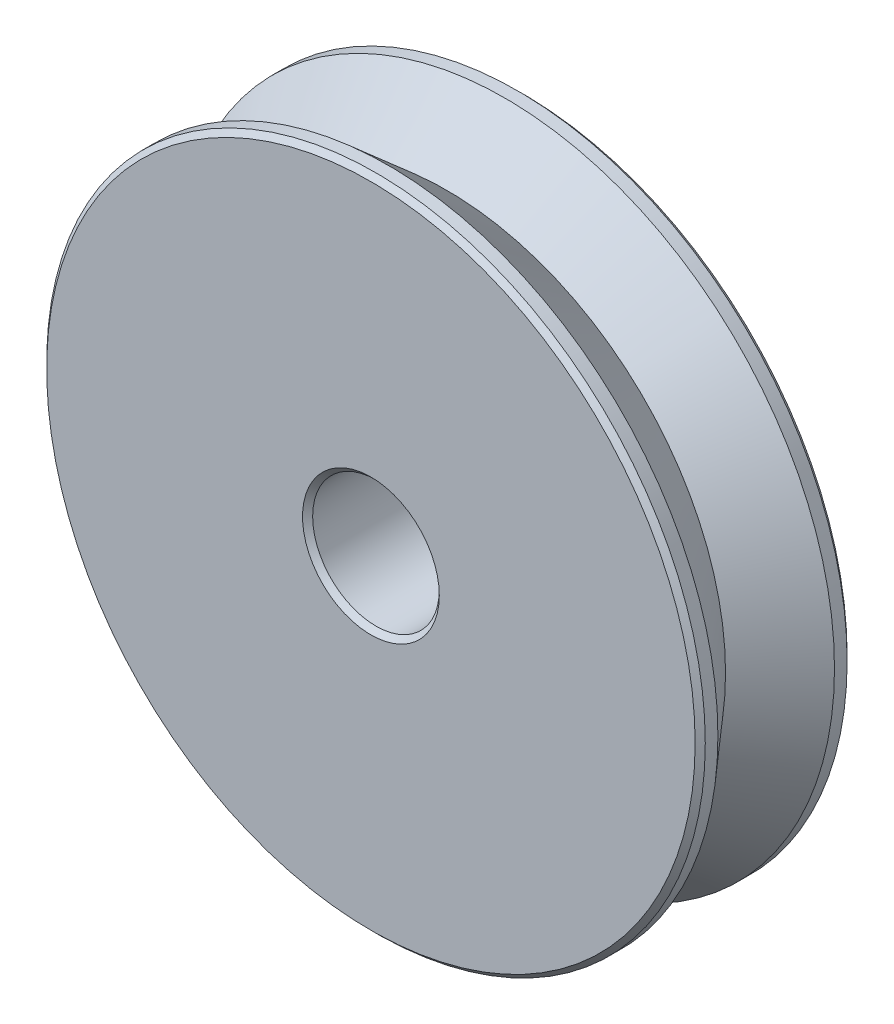
ISO-10303-21;
HEADER;
FILE_DESCRIPTION(('STEP AP214'),'2;1');
FILE_NAME('part.step','',(''),(''),'','','');
FILE_SCHEMA(('AUTOMOTIVE_DESIGN { 1 0 10303 214 1 1 1 1 }'));
ENDSEC;
DATA;
#1=APPLICATION_CONTEXT('core data for automotive mechanical design processes');
#2=APPLICATION_PROTOCOL_DEFINITION('international standard','automotive_design',2000,#1);
#3=PRODUCT_CONTEXT('',#1,'mechanical');
#4=PRODUCT('Part','Part','',(#3));
#5=PRODUCT_RELATED_PRODUCT_CATEGORY('part','',(#4));
#6=PRODUCT_DEFINITION_FORMATION('','',#4);
#7=PRODUCT_DEFINITION_CONTEXT('part definition',#1,'design');
#8=PRODUCT_DEFINITION('design','',#6,#7);
#9=PRODUCT_DEFINITION_SHAPE('','',#8);
#10=(LENGTH_UNIT() NAMED_UNIT(*) SI_UNIT(.MILLI.,.METRE.));
#11=(NAMED_UNIT(*) PLANE_ANGLE_UNIT() SI_UNIT($,.RADIAN.));
#12=(NAMED_UNIT(*) SI_UNIT($,.STERADIAN.) SOLID_ANGLE_UNIT());
#13=UNCERTAINTY_MEASURE_WITH_UNIT(LENGTH_MEASURE(1.E-05),#10,'distance_accuracy_value','');
#14=(GEOMETRIC_REPRESENTATION_CONTEXT(3) GLOBAL_UNCERTAINTY_ASSIGNED_CONTEXT((#13)) GLOBAL_UNIT_ASSIGNED_CONTEXT((#10,
#11,#12)) REPRESENTATION_CONTEXT('',''));
#15=CARTESIAN_POINT('',(0.,0.,0.));
#16=DIRECTION('',(0.,0.,1.));
#17=DIRECTION('',(1.,0.,0.));
#18=AXIS2_PLACEMENT_3D('',#15,#16,#17);
#19=CARTESIAN_POINT('',(0.,0.,3.));
#20=DIRECTION('',(0.,0.,-1.));
#21=DIRECTION('',(-1.,0.,0.));
#22=AXIS2_PLACEMENT_3D('',#19,#20,#21);
#23=CYLINDRICAL_SURFACE('',#22,13.);
#24=CARTESIAN_POINT('',(0.,0.,2.80000000000002));
#25=DIRECTION('',(0.,0.,1.));
#26=DIRECTION('',(1.,0.,0.));
#27=AXIS2_PLACEMENT_3D('',#24,#25,#26);
#28=CIRCLE('',#27,13.);
#29=CARTESIAN_POINT('',(13.,0.,2.80000000000002));
#30=VERTEX_POINT('',#29);
#31=EDGE_CURVE('E10',#30,#30,#28,.F.);
#32=ORIENTED_EDGE('',*,*,#31,.T.);
#33=EDGE_LOOP('',(#32));
#34=FACE_BOUND('',#33,.T.);
#35=CARTESIAN_POINT('',(0.,0.,2.30113545709572));
#36=DIRECTION('',(0.,0.,1.));
#37=DIRECTION('',(1.,0.,0.));
#38=AXIS2_PLACEMENT_3D('',#35,#36,#37);
#39=CIRCLE('',#38,13.);
#40=CARTESIAN_POINT('',(13.,0.,2.30113545709572));
#41=VERTEX_POINT('',#40);
#42=EDGE_CURVE('E74',#41,#41,#39,.T.);
#43=ORIENTED_EDGE('',*,*,#42,.T.);
#44=EDGE_LOOP('',(#43));
#45=FACE_BOUND('',#44,.T.);
#46=ADVANCED_FACE('F41',(#34,#45),#23,.T.);
#47=CARTESIAN_POINT('',(0.,0.,-2.8));
#48=DIRECTION('',(0.,0.,1.));
#49=DIRECTION('',(1.,0.,0.));
#50=AXIS2_PLACEMENT_3D('',#47,#48,#49);
#51=CIRCLE('',#50,13.);
#52=CARTESIAN_POINT('',(13.,0.,-2.8));
#53=VERTEX_POINT('',#52);
#54=EDGE_CURVE('E49',#53,#53,#51,.T.);
#55=ORIENTED_EDGE('',*,*,#54,.T.);
#56=EDGE_LOOP('',(#55));
#57=FACE_BOUND('',#56,.T.);
#58=CARTESIAN_POINT('',(0.,0.,-2.30113545709572));
#59=DIRECTION('',(0.,0.,1.));
#60=DIRECTION('',(1.,0.,0.));
#61=AXIS2_PLACEMENT_3D('',#58,#59,#60);
#62=CIRCLE('',#61,13.);
#63=CARTESIAN_POINT('',(13.,0.,-2.30113545709572));
#64=VERTEX_POINT('',#63);
#65=EDGE_CURVE('E77',#64,#64,#62,.T.);
#66=ORIENTED_EDGE('',*,*,#65,.F.);
#67=EDGE_LOOP('',(#66));
#68=FACE_BOUND('',#67,.T.);
#69=ADVANCED_FACE('F102',(#57,#68),#23,.T.);
#70=CARTESIAN_POINT('',(0.,0.,3.));
#71=DIRECTION('',(0.,0.,1.));
#72=DIRECTION('',(1.,0.,0.));
#73=AXIS2_PLACEMENT_3D('',#70,#71,#72);
#74=PLANE('',#73);
#75=CARTESIAN_POINT('',(0.,0.,3.));
#76=DIRECTION('',(0.,0.,1.));
#77=DIRECTION('',(1.,0.,0.));
#78=AXIS2_PLACEMENT_3D('',#75,#76,#77);
#79=CIRCLE('',#78,2.7);
#80=CARTESIAN_POINT('',(2.7,0.,3.));
#81=VERTEX_POINT('',#80);
#82=EDGE_CURVE('E53',#81,#81,#79,.F.);
#83=ORIENTED_EDGE('',*,*,#82,.T.);
#84=EDGE_LOOP('',(#83));
#85=FACE_BOUND('',#84,.T.);
#86=CARTESIAN_POINT('',(0.,0.,3.));
#87=DIRECTION('',(0.,0.,1.));
#88=DIRECTION('',(1.,0.,0.));
#89=AXIS2_PLACEMENT_3D('',#86,#87,#88);
#90=CIRCLE('',#89,12.8);
#91=CARTESIAN_POINT('',(12.8,0.,3.));
#92=VERTEX_POINT('',#91);
#93=EDGE_CURVE('E57',#92,#92,#90,.T.);
#94=ORIENTED_EDGE('',*,*,#93,.T.);
#95=EDGE_LOOP('',(#94));
#96=FACE_BOUND('',#95,.T.);
#97=ADVANCED_FACE('F107',(#85,#96),#74,.T.);
#98=CARTESIAN_POINT('',(0.,0.,-3.));
#99=DIRECTION('',(0.,0.,1.));
#100=DIRECTION('',(1.,0.,0.));
#101=AXIS2_PLACEMENT_3D('',#98,#99,#100);
#102=PLANE('',#101);
#103=CARTESIAN_POINT('',(0.,0.,-3.));
#104=DIRECTION('',(0.,0.,1.));
#105=DIRECTION('',(1.,0.,0.));
#106=AXIS2_PLACEMENT_3D('',#103,#104,#105);
#107=CIRCLE('',#106,2.7);
#108=CARTESIAN_POINT('',(-2.70000000000001,0.,-3.));
#109=VERTEX_POINT('',#108);
#110=EDGE_CURVE('E68',#109,#109,#107,.T.);
#111=ORIENTED_EDGE('',*,*,#110,.T.);
#112=EDGE_LOOP('',(#111));
#113=FACE_BOUND('',#112,.T.);
#114=CARTESIAN_POINT('',(0.,0.,-3.));
#115=DIRECTION('',(0.,0.,1.));
#116=DIRECTION('',(1.,0.,0.));
#117=AXIS2_PLACEMENT_3D('',#114,#115,#116);
#118=CIRCLE('',#117,12.8);
#119=CARTESIAN_POINT('',(12.8,0.,-3.));
#120=VERTEX_POINT('',#119);
#121=EDGE_CURVE('E71',#120,#120,#118,.F.);
#122=ORIENTED_EDGE('',*,*,#121,.T.);
#123=EDGE_LOOP('',(#122));
#124=FACE_BOUND('',#123,.T.);
#125=ADVANCED_FACE('F110',(#113,#124),#102,.F.);
#126=CARTESIAN_POINT('',(0.,0.,3.));
#127=DIRECTION('',(0.,0.,-1.));
#128=DIRECTION('',(-1.,0.,0.));
#129=AXIS2_PLACEMENT_3D('',#126,#127,#128);
#130=CYLINDRICAL_SURFACE('',#129,2.5);
#131=CARTESIAN_POINT('',(0.,0.,-2.8));
#132=DIRECTION('',(0.,0.,1.));
#133=DIRECTION('',(1.,0.,0.));
#134=AXIS2_PLACEMENT_3D('',#131,#132,#133);
#135=CIRCLE('',#134,2.5);
#136=CARTESIAN_POINT('',(-2.5,0.,-2.8));
#137=VERTEX_POINT('',#136);
#138=EDGE_CURVE('E62',#137,#137,#135,.F.);
#139=ORIENTED_EDGE('',*,*,#138,.T.);
#140=EDGE_LOOP('',(#139));
#141=FACE_BOUND('',#140,.T.);
#142=CARTESIAN_POINT('',(0.,0.,2.8));
#143=DIRECTION('',(0.,0.,1.));
#144=DIRECTION('',(1.,0.,0.));
#145=AXIS2_PLACEMENT_3D('',#142,#143,#144);
#146=CIRCLE('',#145,2.5);
#147=CARTESIAN_POINT('',(2.5,0.,2.8));
#148=VERTEX_POINT('',#147);
#149=EDGE_CURVE('E65',#148,#148,#146,.T.);
#150=ORIENTED_EDGE('',*,*,#149,.T.);
#151=EDGE_LOOP('',(#150));
#152=FACE_BOUND('',#151,.T.);
#153=ADVANCED_FACE('F100',(#141,#152),#130,.F.);
#154=CARTESIAN_POINT('',(0.,0.,2.30113545709572));
#155=DIRECTION('',(0.,0.,1.));
#156=DIRECTION('',(1.,0.,0.));
#157=AXIS2_PLACEMENT_3D('',#154,#155,#156);
#158=CONICAL_SURFACE('',#157,13.,0.715499211203937);
#159=CARTESIAN_POINT('',(0.,0.,0.));
#160=DIRECTION('',(0.,0.,1.));
#161=DIRECTION('',(1.,0.,0.));
#162=AXIS2_PLACEMENT_3D('',#159,#160,#161);
#163=CIRCLE('',#162,11.);
#164=CARTESIAN_POINT('',(11.,0.,0.));
#165=VERTEX_POINT('',#164);
#166=EDGE_CURVE('E80',#165,#165,#163,.T.);
#167=ORIENTED_EDGE('',*,*,#166,.T.);
#168=EDGE_LOOP('',(#167));
#169=FACE_BOUND('',#168,.T.);
#170=ORIENTED_EDGE('',*,*,#42,.F.);
#171=EDGE_LOOP('',(#170));
#172=FACE_BOUND('',#171,.T.);
#173=ADVANCED_FACE('F84',(#169,#172),#158,.T.);
#174=CARTESIAN_POINT('',(0.,0.,0.));
#175=DIRECTION('',(0.,0.,-1.));
#176=DIRECTION('',(-1.,0.,0.));
#177=AXIS2_PLACEMENT_3D('',#174,#175,#176);
#178=CONICAL_SURFACE('',#177,11.,0.715499211203937);
#179=ORIENTED_EDGE('',*,*,#65,.T.);
#180=EDGE_LOOP('',(#179));
#181=FACE_BOUND('',#180,.T.);
#182=ORIENTED_EDGE('',*,*,#166,.F.);
#183=EDGE_LOOP('',(#182));
#184=FACE_BOUND('',#183,.T.);
#185=ADVANCED_FACE('F87',(#181,#184),#178,.T.);
#186=CARTESIAN_POINT('',(0.,0.,-3.));
#187=DIRECTION('',(0.,0.,-1.));
#188=DIRECTION('',(-1.,0.,0.));
#189=AXIS2_PLACEMENT_3D('',#186,#187,#188);
#190=CONICAL_SURFACE('',#189,2.7,0.785398163397447);
#191=CARTESIAN_POINT('',(-2.5,0.,-2.8));
#192=CARTESIAN_POINT('',(-2.50208333333333,0.,-2.80208333333333));
#193=CARTESIAN_POINT('',(-2.50416666666667,0.,-2.80416666666666));
#194=CARTESIAN_POINT('',(-2.50833333333333,0.,-2.80833333333333));
#195=CARTESIAN_POINT('',(-2.51041666666667,0.,-2.81041666666666));
#196=CARTESIAN_POINT('',(-2.51458333333333,0.,-2.81458333333333));
#197=CARTESIAN_POINT('',(-2.51666666666667,0.,-2.81666666666666));
#198=CARTESIAN_POINT('',(-2.52083333333333,0.,-2.82083333333333));
#199=CARTESIAN_POINT('',(-2.52291666666667,0.,-2.82291666666666));
#200=CARTESIAN_POINT('',(-2.52708333333333,0.,-2.82708333333333));
#201=CARTESIAN_POINT('',(-2.52916666666667,0.,-2.82916666666666));
#202=CARTESIAN_POINT('',(-2.53333333333333,0.,-2.83333333333333));
#203=CARTESIAN_POINT('',(-2.53541666666667,0.,-2.83541666666666));
#204=CARTESIAN_POINT('',(-2.53958333333333,0.,-2.83958333333333));
#205=CARTESIAN_POINT('',(-2.54166666666667,0.,-2.84166666666666));
#206=CARTESIAN_POINT('',(-2.54583333333333,0.,-2.84583333333333));
#207=CARTESIAN_POINT('',(-2.54791666666667,0.,-2.84791666666666));
#208=CARTESIAN_POINT('',(-2.55208333333333,0.,-2.85208333333333));
#209=CARTESIAN_POINT('',(-2.55416666666667,0.,-2.85416666666666));
#210=CARTESIAN_POINT('',(-2.55833333333334,0.,-2.85833333333333));
#211=CARTESIAN_POINT('',(-2.56041666666667,0.,-2.86041666666666));
#212=CARTESIAN_POINT('',(-2.56458333333333,0.,-2.86458333333333));
#213=CARTESIAN_POINT('',(-2.56666666666667,0.,-2.86666666666666));
#214=CARTESIAN_POINT('',(-2.57083333333334,0.,-2.87083333333333));
#215=CARTESIAN_POINT('',(-2.57291666666667,0.,-2.87291666666666));
#216=CARTESIAN_POINT('',(-2.57708333333334,0.,-2.87708333333333));
#217=CARTESIAN_POINT('',(-2.57916666666667,0.,-2.87916666666666));
#218=CARTESIAN_POINT('',(-2.58333333333334,0.,-2.88333333333333));
#219=CARTESIAN_POINT('',(-2.58541666666667,0.,-2.88541666666666));
#220=CARTESIAN_POINT('',(-2.58958333333334,0.,-2.88958333333333));
#221=CARTESIAN_POINT('',(-2.59166666666667,0.,-2.89166666666666));
#222=CARTESIAN_POINT('',(-2.59583333333334,0.,-2.89583333333333));
#223=CARTESIAN_POINT('',(-2.59791666666667,0.,-2.89791666666666));
#224=CARTESIAN_POINT('',(-2.60208333333334,0.,-2.90208333333333));
#225=CARTESIAN_POINT('',(-2.60416666666667,0.,-2.90416666666666));
#226=CARTESIAN_POINT('',(-2.60833333333334,0.,-2.90833333333333));
#227=CARTESIAN_POINT('',(-2.61041666666667,0.,-2.91041666666666));
#228=CARTESIAN_POINT('',(-2.61458333333334,0.,-2.91458333333333));
#229=CARTESIAN_POINT('',(-2.61666666666667,0.,-2.91666666666666));
#230=CARTESIAN_POINT('',(-2.62083333333334,0.,-2.92083333333333));
#231=CARTESIAN_POINT('',(-2.62291666666667,0.,-2.92291666666666));
#232=CARTESIAN_POINT('',(-2.62708333333334,0.,-2.92708333333333));
#233=CARTESIAN_POINT('',(-2.62916666666667,0.,-2.92916666666666));
#234=CARTESIAN_POINT('',(-2.63333333333334,0.,-2.93333333333333));
#235=CARTESIAN_POINT('',(-2.63541666666667,0.,-2.93541666666667));
#236=CARTESIAN_POINT('',(-2.63958333333334,0.,-2.93958333333333));
#237=CARTESIAN_POINT('',(-2.64166666666667,0.,-2.94166666666667));
#238=CARTESIAN_POINT('',(-2.64583333333334,0.,-2.94583333333333));
#239=CARTESIAN_POINT('',(-2.64791666666667,0.,-2.94791666666667));
#240=CARTESIAN_POINT('',(-2.65208333333334,0.,-2.95208333333333));
#241=CARTESIAN_POINT('',(-2.65416666666667,0.,-2.95416666666667));
#242=CARTESIAN_POINT('',(-2.65833333333334,0.,-2.95833333333333));
#243=CARTESIAN_POINT('',(-2.66041666666667,0.,-2.96041666666667));
#244=CARTESIAN_POINT('',(-2.66458333333334,0.,-2.96458333333333));
#245=CARTESIAN_POINT('',(-2.66666666666667,0.,-2.96666666666667));
#246=CARTESIAN_POINT('',(-2.67083333333334,0.,-2.97083333333333));
#247=CARTESIAN_POINT('',(-2.67291666666667,0.,-2.97291666666667));
#248=CARTESIAN_POINT('',(-2.67708333333334,0.,-2.97708333333333));
#249=CARTESIAN_POINT('',(-2.67916666666667,0.,-2.97916666666667));
#250=CARTESIAN_POINT('',(-2.68333333333334,0.,-2.98333333333333));
#251=CARTESIAN_POINT('',(-2.68541666666667,0.,-2.98541666666667));
#252=CARTESIAN_POINT('',(-2.68958333333334,0.,-2.98958333333333));
#253=CARTESIAN_POINT('',(-2.69166666666667,0.,-2.99166666666667));
#254=CARTESIAN_POINT('',(-2.69583333333334,0.,-2.99583333333333));
#255=CARTESIAN_POINT('',(-2.69791666666667,0.,-2.99791666666667));
#256=CARTESIAN_POINT('',(-2.7,0.,-3.));
#257=B_SPLINE_CURVE_WITH_KNOTS('',3,(#191,#192,#193,#194,#195,#196,#197,#198,#199,#200,#201,
#202,#203,#204,#205,#206,#207,#208,#209,#210,#211,#212,#213,#214,#215,#216,#217,#218,#219,#220,
#221,#222,#223,#224,#225,#226,#227,#228,#229,#230,#231,#232,#233,#234,#235,#236,#237,#238,#239,
#240,#241,#242,#243,#244,#245,#246,#247,#248,#249,#250,#251,#252,#253,#254,#255,#256),
.UNSPECIFIED.,.F.,.F.,(4,2,2,2,2,2,2,2,2,2,2,2,2,2,2,2,2,2,2,2,2,2,2,2,2,2,2,2,2,2,2,2,4),(0.,
0.00883883476483148,0.0176776695296636,0.0265165042944957,0.0353553390593278,0.0441941738241599,
0.053033008588992,0.0618718433538241,0.0707106781186562,0.0795495128834883,0.0883883476483204,
0.0972271824131522,0.106066017177984,0.114904851942816,0.123743686707648,0.132582521472481,
0.141421356237313,0.150260191002144,0.159099025766977,0.167937860531809,0.176776695296641,
0.185615530061473,0.194454364826305,0.203293199591137,0.212132034355969,0.220970869120801,
0.229809703885633,0.238648538650465,0.247487373415297,0.256326208180129,0.265165042944961,
0.274003877709793,0.282842712474625),.UNSPECIFIED.);
#258=EDGE_CURVE('BSEAM89',#137,#109,#257,.T.);
#259=ORIENTED_EDGE('',*,*,#138,.F.);
#260=ORIENTED_EDGE('',*,*,#110,.F.);
#261=ORIENTED_EDGE('',*,*,#258,.T.);
#262=ORIENTED_EDGE('',*,*,#258,.F.);
#263=EDGE_LOOP('',(#259,#261,#260,#262));
#264=FACE_BOUND('',#263,.T.);
#265=ADVANCED_FACE('F89',(#264),#190,.F.);
#266=CARTESIAN_POINT('',(0.,0.,2.8));
#267=DIRECTION('',(0.,0.,1.));
#268=DIRECTION('',(1.,0.,0.));
#269=AXIS2_PLACEMENT_3D('',#266,#267,#268);
#270=CONICAL_SURFACE('',#269,2.5,0.785398163397441);
#271=ORIENTED_EDGE('',*,*,#82,.F.);
#272=EDGE_LOOP('',(#271));
#273=FACE_BOUND('',#272,.T.);
#274=ORIENTED_EDGE('',*,*,#149,.F.);
#275=EDGE_LOOP('',(#274));
#276=FACE_BOUND('',#275,.T.);
#277=ADVANCED_FACE('F97',(#273,#276),#270,.F.);
#278=CARTESIAN_POINT('',(0.,0.,-2.8));
#279=DIRECTION('',(0.,0.,1.));
#280=DIRECTION('',(1.,0.,0.));
#281=AXIS2_PLACEMENT_3D('',#278,#279,#280);
#282=CONICAL_SURFACE('',#281,13.,0.785398163397448);
#283=ORIENTED_EDGE('',*,*,#121,.F.);
#284=EDGE_LOOP('',(#283));
#285=FACE_BOUND('',#284,.T.);
#286=ORIENTED_EDGE('',*,*,#54,.F.);
#287=EDGE_LOOP('',(#286));
#288=FACE_BOUND('',#287,.T.);
#289=ADVANCED_FACE('F121',(#285,#288),#282,.T.);
#290=CARTESIAN_POINT('',(0.,0.,3.));
#291=DIRECTION('',(0.,0.,-1.));
#292=DIRECTION('',(-1.,0.,0.));
#293=AXIS2_PLACEMENT_3D('',#290,#291,#292);
#294=CONICAL_SURFACE('',#293,12.8,0.785398163397457);
#295=ORIENTED_EDGE('',*,*,#31,.F.);
#296=EDGE_LOOP('',(#295));
#297=FACE_BOUND('',#296,.T.);
#298=ORIENTED_EDGE('',*,*,#93,.F.);
#299=EDGE_LOOP('',(#298));
#300=FACE_BOUND('',#299,.T.);
#301=ADVANCED_FACE('F44',(#297,#300),#294,.T.);
#302=CLOSED_SHELL('',(#46,#69,#97,#125,#153,#173,#185,#265,#277,#289,#301));
#303=MANIFOLD_SOLID_BREP('B2',#302);
#304=ADVANCED_BREP_SHAPE_REPRESENTATION('',(#18,#303),#14);
#305=SHAPE_DEFINITION_REPRESENTATION(#9,#304);
ENDSEC;
END-ISO-10303-21;
